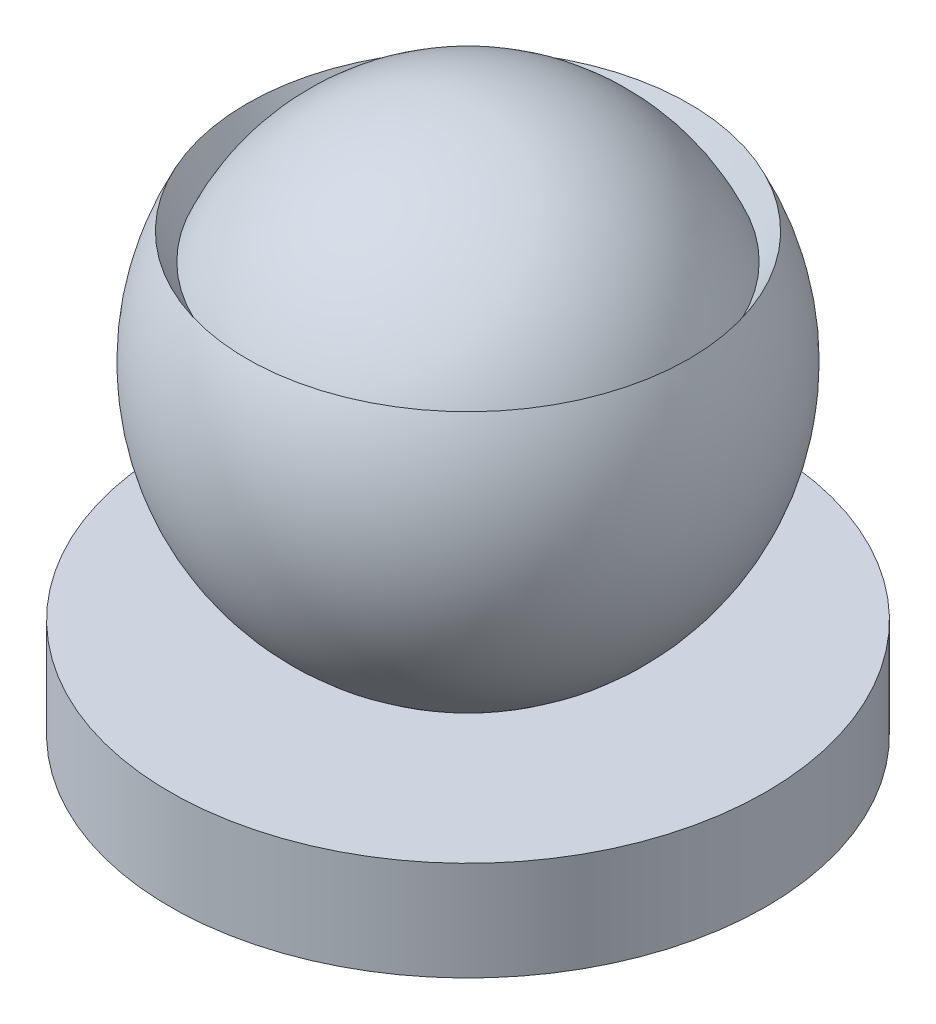
ISO-10303-21;
HEADER;
FILE_DESCRIPTION(('STEP AP214'),'2;1');
FILE_NAME('part.step','',(''),(''),'','','');
FILE_SCHEMA(('AUTOMOTIVE_DESIGN { 1 0 10303 214 1 1 1 1 }'));
ENDSEC;
DATA;
#1=APPLICATION_CONTEXT('core data for automotive mechanical design processes');
#2=APPLICATION_PROTOCOL_DEFINITION('international standard','automotive_design',2000,#1);
#3=PRODUCT_CONTEXT('',#1,'mechanical');
#4=PRODUCT('Part','Part','',(#3));
#5=PRODUCT_RELATED_PRODUCT_CATEGORY('part','',(#4));
#6=PRODUCT_DEFINITION_FORMATION('','',#4);
#7=PRODUCT_DEFINITION_CONTEXT('part definition',#1,'design');
#8=PRODUCT_DEFINITION('design','',#6,#7);
#9=PRODUCT_DEFINITION_SHAPE('','',#8);
#10=(LENGTH_UNIT() NAMED_UNIT(*) SI_UNIT(.MILLI.,.METRE.));
#11=(NAMED_UNIT(*) PLANE_ANGLE_UNIT() SI_UNIT($,.RADIAN.));
#12=(NAMED_UNIT(*) SI_UNIT($,.STERADIAN.) SOLID_ANGLE_UNIT());
#13=UNCERTAINTY_MEASURE_WITH_UNIT(LENGTH_MEASURE(1.E-05),#10,'distance_accuracy_value','');
#14=(GEOMETRIC_REPRESENTATION_CONTEXT(3) GLOBAL_UNCERTAINTY_ASSIGNED_CONTEXT((#13)) GLOBAL_UNIT_ASSIGNED_CONTEXT((#10,
#11,#12)) REPRESENTATION_CONTEXT('',''));
#15=CARTESIAN_POINT('',(0.,0.,0.));
#16=DIRECTION('',(0.,0.,1.));
#17=DIRECTION('',(1.,0.,0.));
#18=AXIS2_PLACEMENT_3D('',#15,#16,#17);
#19=CARTESIAN_POINT('',(0.,-13.,0.));
#20=DIRECTION('',(0.,1.,0.));
#21=DIRECTION('',(-1.,0.,0.));
#22=AXIS2_PLACEMENT_3D('',#19,#20,#21);
#23=PLANE('',#22);
#24=CARTESIAN_POINT('',(0.,-13.,0.));
#25=DIRECTION('',(0.,1.,0.));
#26=DIRECTION('',(-1.,0.,0.));
#27=AXIS2_PLACEMENT_3D('',#24,#25,#26);
#28=CIRCLE('',#27,12.);
#29=CARTESIAN_POINT('',(-12.,-13.,0.));
#30=VERTEX_POINT('',#29);
#31=EDGE_CURVE('E10',#30,#30,#28,.T.);
#32=ORIENTED_EDGE('',*,*,#31,.F.);
#33=EDGE_LOOP('',(#32));
#34=FACE_BOUND('',#33,.T.);
#35=ADVANCED_FACE('F41',(#34),#23,.F.);
#36=CARTESIAN_POINT('',(0.,9.,0.));
#37=DIRECTION('',(0.,1.,0.));
#38=DIRECTION('',(-1.,0.,0.));
#39=AXIS2_PLACEMENT_3D('',#36,#37,#38);
#40=CYLINDRICAL_SURFACE('',#39,12.);
#41=CARTESIAN_POINT('',(0.,-9.,0.));
#42=DIRECTION('',(0.,1.,0.));
#43=DIRECTION('',(-1.,0.,0.));
#44=AXIS2_PLACEMENT_3D('',#41,#42,#43);
#45=CIRCLE('',#44,12.);
#46=CARTESIAN_POINT('',(-12.,-9.,0.));
#47=VERTEX_POINT('',#46);
#48=EDGE_CURVE('E48',#47,#47,#45,.T.);
#49=ORIENTED_EDGE('',*,*,#48,.F.);
#50=EDGE_LOOP('',(#49));
#51=FACE_BOUND('',#50,.T.);
#52=ORIENTED_EDGE('',*,*,#31,.T.);
#53=EDGE_LOOP('',(#52));
#54=FACE_BOUND('',#53,.T.);
#55=ADVANCED_FACE('F85',(#51,#54),#40,.T.);
#56=CARTESIAN_POINT('',(12.,-9.,0.));
#57=DIRECTION('',(0.,-1.,0.));
#58=DIRECTION('',(1.,0.,0.));
#59=AXIS2_PLACEMENT_3D('',#56,#57,#58);
#60=PLANE('',#59);
#61=CARTESIAN_POINT('',(0.,-9.,0.));
#62=DIRECTION('',(0.,1.,0.));
#63=DIRECTION('',(-1.,0.,0.));
#64=AXIS2_PLACEMENT_3D('',#61,#62,#63);
#65=CIRCLE('',#64,4.35889894354067);
#66=CARTESIAN_POINT('',(4.35889894354068,-9.,0.));
#67=VERTEX_POINT('',#66);
#68=EDGE_CURVE('E53',#67,#67,#65,.T.);
#69=ORIENTED_EDGE('',*,*,#68,.F.);
#70=EDGE_LOOP('',(#69));
#71=FACE_BOUND('',#70,.T.);
#72=ORIENTED_EDGE('',*,*,#48,.T.);
#73=EDGE_LOOP('',(#72));
#74=FACE_BOUND('',#73,.T.);
#75=ADVANCED_FACE('F80',(#71,#74),#60,.F.);
#76=CARTESIAN_POINT('',(0.,0.,0.));
#77=DIRECTION('',(0.,1.,0.));
#78=DIRECTION('',(1.,0.,0.));
#79=AXIS2_PLACEMENT_3D('',#76,#77,#78);
#80=SPHERICAL_SURFACE('',#79,10.);
#81=CARTESIAN_POINT('',(0.,4.55655292339224,0.));
#82=DIRECTION('',(0.,1.,0.));
#83=DIRECTION('',(-1.,0.,0.));
#84=AXIS2_PLACEMENT_3D('',#81,#82,#83);
#85=CIRCLE('',#84,8.9015630906221);
#86=CARTESIAN_POINT('',(8.9015630906221,4.55655292339224,0.));
#87=VERTEX_POINT('',#86);
#88=EDGE_CURVE('E58',#87,#87,#85,.T.);
#89=CARTESIAN_POINT('',(8.9015630906221,4.55655292339224,0.));
#90=CARTESIAN_POINT('',(8.97717093564196,4.40885546150287,0.));
#91=CARTESIAN_POINT('',(9.04909618104483,4.25927329767679,0.));
#92=CARTESIAN_POINT('',(9.18541800286567,3.95671675080591,0.));
#93=CARTESIAN_POINT('',(9.24981457928363,3.80374236776113,0.));
#94=CARTESIAN_POINT('',(9.3709155933837,3.49477856710758,0.));
#95=CARTESIAN_POINT('',(9.4276200310658,3.33878914949881,0.));
#96=CARTESIAN_POINT('',(9.53319735095238,3.02418218516527,0.));
#97=CARTESIAN_POINT('',(9.58207023315686,2.8655646384405,0.));
#98=CARTESIAN_POINT('',(9.67186308725443,2.54609422859426,0.));
#99=CARTESIAN_POINT('',(9.71278305914753,2.38524136547281,0.));
#100=CARTESIAN_POINT('',(9.78656879818019,2.06169883472438,0.));
#101=CARTESIAN_POINT('',(9.81943456531975,1.89900916709741,0.));
#102=CARTESIAN_POINT('',(9.87703045679104,1.57219604619181,0.));
#103=CARTESIAN_POINT('',(9.90176058112276,1.40807259291318,0.));
#104=CARTESIAN_POINT('',(9.94302392895729,1.07879848305498,0.));
#105=CARTESIAN_POINT('',(9.95955715246009,0.913647826475398,0.));
#106=CARTESIAN_POINT('',(9.98438573973913,0.582728433927039,0.));
#107=CARTESIAN_POINT('',(9.99268110351536,0.416959697958258,0.));
#108=CARTESIAN_POINT('',(10.0010134217858,0.0852148025328598,0.));
#109=CARTESIAN_POINT('',(10.0010503762799,-0.0807613569237575,0.));
#110=CARTESIAN_POINT('',(9.99286578433485,-0.41250992980051,0.));
#111=CARTESIAN_POINT('',(9.98464423789558,-0.578282343220645,0.));
#112=CARTESIAN_POINT('',(9.9599630111917,-0.909212759176452,0.));
#113=CARTESIAN_POINT('',(9.94350333092709,-1.07437076171212,0.));
#114=CARTESIAN_POINT('',(9.90238661181675,-1.4036632131354,0.));
#115=CARTESIAN_POINT('',(9.87772957297102,-1.56779766202302,0.));
#116=CARTESIAN_POINT('',(9.82027921911209,-1.8946363990122,0.));
#117=CARTESIAN_POINT('',(9.78748590409889,-2.05734068711377,0.));
#118=CARTESIAN_POINT('',(9.71384423615778,-2.38091603830407,0.));
#119=CARTESIAN_POINT('',(9.67299588322988,-2.54178710139279,0.));
#120=CARTESIAN_POINT('',(9.58334533230445,-2.8612974797436,0.));
#121=CARTESIAN_POINT('',(9.53454313430693,-3.01993679500569,0.));
#122=CARTESIAN_POINT('',(9.42910578999576,-3.3345906835558,0.));
#123=CARTESIAN_POINT('',(9.37247064368211,-3.49060525684382,0.));
#124=CARTESIAN_POINT('',(9.25150770390555,-3.79962316952158,0.));
#125=CARTESIAN_POINT('',(9.18717991044264,-3.95262650891132,0.));
#126=CARTESIAN_POINT('',(9.05099103438229,-4.25524292154039,0.));
#127=CARTESIAN_POINT('',(8.97912995178484,-4.40485599477973,0.));
#128=CARTESIAN_POINT('',(8.82805251754386,-4.70032124149812,0.));
#129=CARTESIAN_POINT('',(8.74883616590033,-4.84617341497719,0.));
#130=CARTESIAN_POINT('',(8.58324443472188,-5.13375554536793,0.));
#131=CARTESIAN_POINT('',(8.49686905518696,-5.2754855022796,0.));
#132=CARTESIAN_POINT('',(8.31717324430861,-5.55447209462601,0.));
#133=CARTESIAN_POINT('',(8.22385281296517,-5.69172873006075,0.));
#134=CARTESIAN_POINT('',(8.03049807937818,-5.96142865618342,0.));
#135=CARTESIAN_POINT('',(7.93046377713462,-6.09387194687135,0.));
#136=CARTESIAN_POINT('',(7.72392911486992,-6.35361708436535,0.));
#137=CARTESIAN_POINT('',(7.61742875484879,-6.48091893117142,0.));
#138=CARTESIAN_POINT('',(7.39822580813201,-6.73006581809062,0.));
#139=CARTESIAN_POINT('',(7.28552322143637,-6.85191085820375,0.));
#140=CARTESIAN_POINT('',(7.05419501810538,-7.08984228874853,0.));
#141=CARTESIAN_POINT('',(6.93556940147004,-7.20592867918018,0.));
#142=CARTESIAN_POINT('',(6.69268900436847,-7.43205522652528,0.));
#143=CARTESIAN_POINT('',(6.56843422390224,-7.54209538343872,0.));
#144=CARTESIAN_POINT('',(6.31460332383382,-7.75585688291453,0.));
#145=CARTESIAN_POINT('',(6.18502720423163,-7.85957822547689,0.));
#146=CARTESIAN_POINT('',(5.92087458240908,-8.06044507639705,0.));
#147=CARTESIAN_POINT('',(5.78629808018872,-8.15759058475485,0.));
#148=CARTESIAN_POINT('',(5.51247822594991,-8.34506538281111,0.));
#149=CARTESIAN_POINT('',(5.37323487393146,-8.43539467250958,0.));
#150=CARTESIAN_POINT('',(5.09042570884405,-8.60901224613884,0.));
#151=CARTESIAN_POINT('',(4.94685989577509,-8.69230053006964,0.));
#152=CARTESIAN_POINT('',(4.65576353701621,-8.85163355576206,0.));
#153=CARTESIAN_POINT('',(4.5082329913263,-8.92767829752369,0.));
#154=CARTESIAN_POINT('',(4.35889894354068,-9.,0.));
#155=B_SPLINE_CURVE_WITH_KNOTS('',3,(#89,#90,#91,#92,#93,#94,#95,#96,#97,#98,#99,#100,#101,#102,
#103,#104,#105,#106,#107,#108,#109,#110,#111,#112,#113,#114,#115,#116,#117,#118,#119,#120,#121,
#122,#123,#124,#125,#126,#127,#128,#129,#130,#131,#132,#133,#134,#135,#136,#137,#138,#139,#140,
#141,#142,#143,#144,#145,#146,#147,#148,#149,#150,#151,#152,#153,#154),.UNSPECIFIED.,.F.,.F.,(4,
2,2,2,2,2,2,2,2,2,2,2,2,2,2,2,2,2,2,2,2,2,2,2,2,2,2,2,2,2,2,2,4),(0.,0.49772290594443,
0.99544581188886,1.49316871783329,1.99089162377772,2.48861452972215,2.98633743566658,
3.48406034161101,3.98178324755544,4.47950615349987,4.9772290594443,5.47495196538873,
5.97267487133316,6.47039777727759,6.96812068322202,7.46584358916645,7.96356649511088,
8.46128940105531,8.95901230699974,9.45673521294417,9.9544581188886,10.452181024833,
10.9499039307775,11.4476268367219,11.9453497426663,12.4430726486107,12.9407955545552,
13.4385184604996,13.936241366444,14.4339642723885,14.9316871783329,15.4294100842773,
15.9271329902217),.UNSPECIFIED.);
#156=EDGE_CURVE('BSEAM74',#87,#67,#155,.T.);
#157=ORIENTED_EDGE('',*,*,#88,.F.);
#158=ORIENTED_EDGE('',*,*,#68,.T.);
#159=ORIENTED_EDGE('',*,*,#156,.T.);
#160=ORIENTED_EDGE('',*,*,#156,.F.);
#161=EDGE_LOOP('',(#157,#159,#158,#160));
#162=FACE_BOUND('',#161,.T.);
#163=ADVANCED_FACE('F74',(#162),#80,.T.);
#164=CARTESIAN_POINT('',(0.,4.55655292339224,0.));
#165=DIRECTION('',(0.,1.,0.));
#166=DIRECTION('',(-1.,0.,0.));
#167=AXIS2_PLACEMENT_3D('',#164,#165,#166);
#168=CONICAL_SURFACE('',#167,8.9015630906221,0.523598775598298);
#169=CARTESIAN_POINT('',(0.,3.5,0.));
#170=DIRECTION('',(0.,1.,0.));
#171=DIRECTION('',(-1.,0.,0.));
#172=AXIS2_PLACEMENT_3D('',#169,#170,#171);
#173=CIRCLE('',#172,8.2915619758885);
#174=CARTESIAN_POINT('',(-8.2915619758885,3.5,0.));
#175=VERTEX_POINT('',#174);
#176=EDGE_CURVE('E64',#175,#175,#173,.T.);
#177=ORIENTED_EDGE('',*,*,#176,.F.);
#178=EDGE_LOOP('',(#177));
#179=FACE_BOUND('',#178,.T.);
#180=ORIENTED_EDGE('',*,*,#88,.T.);
#181=EDGE_LOOP('',(#180));
#182=FACE_BOUND('',#181,.T.);
#183=ADVANCED_FACE('F71',(#179,#182),#168,.F.);
#184=CARTESIAN_POINT('',(0.,0.,0.));
#185=DIRECTION('',(0.,1.,0.));
#186=DIRECTION('',(1.,0.,0.));
#187=AXIS2_PLACEMENT_3D('',#184,#185,#186);
#188=SPHERICAL_SURFACE('',#187,9.);
#189=ORIENTED_EDGE('',*,*,#176,.T.);
#190=EDGE_LOOP('',(#189));
#191=FACE_BOUND('',#190,.T.);
#192=ADVANCED_FACE('F69',(#191),#188,.T.);
#193=CLOSED_SHELL('',(#35,#55,#75,#163,#183,#192));
#194=MANIFOLD_SOLID_BREP('B2',#193);
#195=ADVANCED_BREP_SHAPE_REPRESENTATION('',(#18,#194),#14);
#196=SHAPE_DEFINITION_REPRESENTATION(#9,#195);
ENDSEC;
END-ISO-10303-21;
